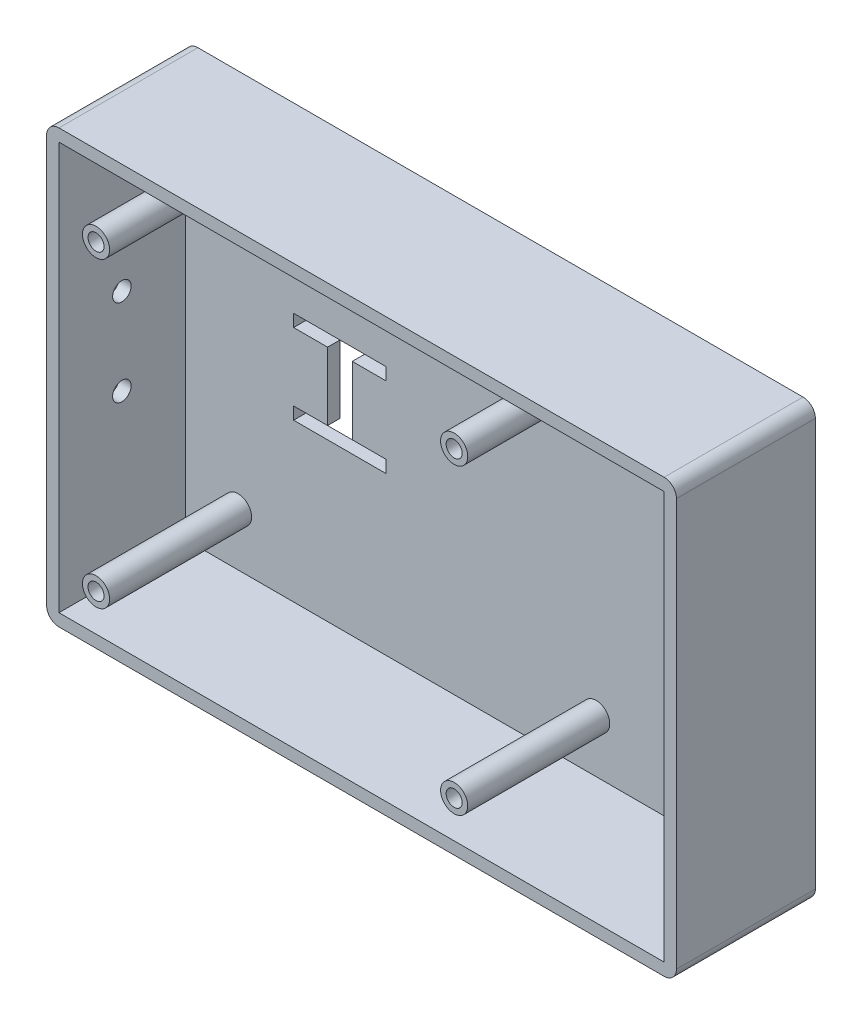
ISO-10303-21;
HEADER;
FILE_DESCRIPTION(('STEP AP214'),'2;1');
FILE_NAME('part.step','',(''),(''),'','','');
FILE_SCHEMA(('AUTOMOTIVE_DESIGN { 1 0 10303 214 1 1 1 1 }'));
ENDSEC;
DATA;
#1=APPLICATION_CONTEXT('core data for automotive mechanical design processes');
#2=APPLICATION_PROTOCOL_DEFINITION('international standard','automotive_design',2000,#1);
#3=PRODUCT_CONTEXT('',#1,'mechanical');
#4=PRODUCT('Part','Part','',(#3));
#5=PRODUCT_RELATED_PRODUCT_CATEGORY('part','',(#4));
#6=PRODUCT_DEFINITION_FORMATION('','',#4);
#7=PRODUCT_DEFINITION_CONTEXT('part definition',#1,'design');
#8=PRODUCT_DEFINITION('design','',#6,#7);
#9=PRODUCT_DEFINITION_SHAPE('','',#8);
#10=(LENGTH_UNIT() NAMED_UNIT(*) SI_UNIT(.MILLI.,.METRE.));
#11=(NAMED_UNIT(*) PLANE_ANGLE_UNIT() SI_UNIT($,.RADIAN.));
#12=(NAMED_UNIT(*) SI_UNIT($,.STERADIAN.) SOLID_ANGLE_UNIT());
#13=UNCERTAINTY_MEASURE_WITH_UNIT(LENGTH_MEASURE(1.E-05),#10,'distance_accuracy_value','');
#14=(GEOMETRIC_REPRESENTATION_CONTEXT(3) GLOBAL_UNCERTAINTY_ASSIGNED_CONTEXT((#13)) GLOBAL_UNIT_ASSIGNED_CONTEXT((#10,
#11,#12)) REPRESENTATION_CONTEXT('',''));
#15=CARTESIAN_POINT('',(0.,0.,0.));
#16=DIRECTION('',(0.,0.,1.));
#17=DIRECTION('',(1.,0.,0.));
#18=AXIS2_PLACEMENT_3D('',#15,#16,#17);
#19=CARTESIAN_POINT('',(-7.,0.,22.5));
#20=DIRECTION('',(-1.,0.,0.));
#21=DIRECTION('',(0.,0.,1.));
#22=AXIS2_PLACEMENT_3D('',#19,#20,#21);
#23=PLANE('',#22);
#24=DIRECTION('',(0.,1.,0.));
#25=VECTOR('',#24,1.);
#26=CARTESIAN_POINT('',(-7.,0.,0.));
#27=LINE('',#26,#25);
#28=CARTESIAN_POINT('',(-7.,-4.99999999999999,0.));
#29=VERTEX_POINT('',#28);
#30=CARTESIAN_POINT('',(-7.,61.,0.));
#31=VERTEX_POINT('',#30);
#32=EDGE_CURVE('E376',#29,#31,#27,.T.);
#33=ORIENTED_EDGE('',*,*,#32,.F.);
#34=DIRECTION('',(0.,0.,-1.));
#35=VECTOR('',#34,1.);
#36=CARTESIAN_POINT('',(-7.,-4.99999999999999,22.5));
#37=LINE('',#36,#35);
#38=CARTESIAN_POINT('',(-7.,-4.99999999999999,22.5));
#39=VERTEX_POINT('',#38);
#40=EDGE_CURVE('E404',#39,#29,#37,.T.);
#41=ORIENTED_EDGE('',*,*,#40,.F.);
#42=DIRECTION('',(0.,1.,0.));
#43=VECTOR('',#42,1.);
#44=CARTESIAN_POINT('',(-7.,0.,22.5));
#45=LINE('',#44,#43);
#46=CARTESIAN_POINT('',(-7.,61.,22.5));
#47=VERTEX_POINT('',#46);
#48=EDGE_CURVE('E354',#39,#47,#45,.T.);
#49=ORIENTED_EDGE('',*,*,#48,.T.);
#50=DIRECTION('',(0.,0.,-1.));
#51=VECTOR('',#50,1.);
#52=CARTESIAN_POINT('',(-7.,61.,22.5));
#53=LINE('',#52,#51);
#54=EDGE_CURVE('E406',#47,#31,#53,.T.);
#55=ORIENTED_EDGE('',*,*,#54,.T.);
#56=EDGE_LOOP('',(#33,#41,#49,#55));
#57=FACE_BOUND('',#56,.T.);
#58=CARTESIAN_POINT('',(-7.,35.,12.3117084700324));
#59=DIRECTION('',(-1.,0.,0.));
#60=DIRECTION('',(0.,0.,1.));
#61=AXIS2_PLACEMENT_3D('',#58,#59,#60);
#62=CIRCLE('',#61,1.5);
#63=CARTESIAN_POINT('',(-7.,35.,13.8117084700324));
#64=VERTEX_POINT('',#63);
#65=EDGE_CURVE('E435',#64,#64,#62,.T.);
#66=ORIENTED_EDGE('',*,*,#65,.F.);
#67=EDGE_LOOP('',(#66));
#68=FACE_BOUND('',#67,.T.);
#69=CARTESIAN_POINT('',(-7.,21.,12.3117084700324));
#70=DIRECTION('',(-1.,0.,0.));
#71=DIRECTION('',(0.,0.,1.));
#72=AXIS2_PLACEMENT_3D('',#69,#70,#71);
#73=CIRCLE('',#72,1.5);
#74=CARTESIAN_POINT('',(-7.,21.,13.8117084700324));
#75=VERTEX_POINT('',#74);
#76=EDGE_CURVE('E430',#75,#75,#73,.F.);
#77=ORIENTED_EDGE('',*,*,#76,.T.);
#78=EDGE_LOOP('',(#77));
#79=FACE_BOUND('',#78,.T.);
#80=ADVANCED_FACE('F33',(#57,#68,#79),#23,.T.);
#81=CARTESIAN_POINT('',(-5.,0.,22.5));
#82=DIRECTION('',(-1.,0.,0.));
#83=DIRECTION('',(0.,0.,1.));
#84=AXIS2_PLACEMENT_3D('',#81,#82,#83);
#85=PLANE('',#84);
#86=CARTESIAN_POINT('',(-5.,35.,12.3117084700324));
#87=DIRECTION('',(-1.,0.,0.));
#88=DIRECTION('',(0.,0.,1.));
#89=AXIS2_PLACEMENT_3D('',#86,#87,#88);
#90=CIRCLE('',#89,1.5);
#91=CARTESIAN_POINT('',(-5.,35.,13.8117084700324));
#92=VERTEX_POINT('',#91);
#93=EDGE_CURVE('E428',#92,#92,#90,.T.);
#94=ORIENTED_EDGE('',*,*,#93,.T.);
#95=EDGE_LOOP('',(#94));
#96=FACE_BOUND('',#95,.T.);
#97=DIRECTION('',(0.,1.,0.));
#98=VECTOR('',#97,1.);
#99=CARTESIAN_POINT('',(-5.,-5.,2.));
#100=LINE('',#99,#98);
#101=CARTESIAN_POINT('',(-5.,-5.,2.));
#102=VERTEX_POINT('',#101);
#103=CARTESIAN_POINT('',(-5.,61.,2.));
#104=VERTEX_POINT('',#103);
#105=EDGE_CURVE('E337',#102,#104,#100,.T.);
#106=ORIENTED_EDGE('',*,*,#105,.T.);
#107=DIRECTION('',(0.,0.,-1.));
#108=VECTOR('',#107,1.);
#109=CARTESIAN_POINT('',(-5.,61.,22.5));
#110=LINE('',#109,#108);
#111=CARTESIAN_POINT('',(-5.,61.,22.5));
#112=VERTEX_POINT('',#111);
#113=EDGE_CURVE('E413',#112,#104,#110,.T.);
#114=ORIENTED_EDGE('',*,*,#113,.F.);
#115=DIRECTION('',(0.,1.,0.));
#116=VECTOR('',#115,1.);
#117=CARTESIAN_POINT('',(-5.,0.,22.5));
#118=LINE('',#117,#116);
#119=CARTESIAN_POINT('',(-5.,-5.,22.5));
#120=VERTEX_POINT('',#119);
#121=EDGE_CURVE('E345',#120,#112,#118,.T.);
#122=ORIENTED_EDGE('',*,*,#121,.F.);
#123=DIRECTION('',(0.,0.,-1.));
#124=VECTOR('',#123,1.);
#125=CARTESIAN_POINT('',(-5.,-5.,22.5));
#126=LINE('',#125,#124);
#127=EDGE_CURVE('E416',#120,#102,#126,.T.);
#128=ORIENTED_EDGE('',*,*,#127,.T.);
#129=EDGE_LOOP('',(#106,#114,#122,#128));
#130=FACE_BOUND('',#129,.T.);
#131=CARTESIAN_POINT('',(-5.,21.,12.3117084700324));
#132=DIRECTION('',(-1.,0.,0.));
#133=DIRECTION('',(0.,0.,1.));
#134=AXIS2_PLACEMENT_3D('',#131,#132,#133);
#135=CIRCLE('',#134,1.5);
#136=CARTESIAN_POINT('',(-5.,21.,13.8117084700324));
#137=VERTEX_POINT('',#136);
#138=EDGE_CURVE('E37',#137,#137,#135,.F.);
#139=ORIENTED_EDGE('',*,*,#138,.F.);
#140=EDGE_LOOP('',(#139));
#141=FACE_BOUND('',#140,.T.);
#142=ADVANCED_FACE('F496',(#96,#130,#141),#85,.F.);
#143=CARTESIAN_POINT('',(0.,0.,2.));
#144=DIRECTION('',(0.,0.,1.));
#145=DIRECTION('',(1.,0.,0.));
#146=AXIS2_PLACEMENT_3D('',#143,#144,#145);
#147=PLANE('',#146);
#148=CARTESIAN_POINT('',(3.5,52.5,2.));
#149=DIRECTION('',(0.,0.,1.));
#150=DIRECTION('',(1.,0.,0.));
#151=AXIS2_PLACEMENT_3D('',#148,#149,#150);
#152=CIRCLE('',#151,2.2);
#153=CARTESIAN_POINT('',(5.7,52.5,2.));
#154=VERTEX_POINT('',#153);
#155=EDGE_CURVE('E298',#154,#154,#152,.F.);
#156=ORIENTED_EDGE('',*,*,#155,.T.);
#157=EDGE_LOOP('',(#156));
#158=FACE_BOUND('',#157,.T.);
#159=CARTESIAN_POINT('',(61.5,52.5,2.));
#160=DIRECTION('',(0.,0.,1.));
#161=DIRECTION('',(1.,0.,0.));
#162=AXIS2_PLACEMENT_3D('',#159,#160,#161);
#163=CIRCLE('',#162,2.2);
#164=CARTESIAN_POINT('',(63.7,52.5,2.));
#165=VERTEX_POINT('',#164);
#166=EDGE_CURVE('E307',#165,#165,#163,.F.);
#167=ORIENTED_EDGE('',*,*,#166,.T.);
#168=EDGE_LOOP('',(#167));
#169=FACE_BOUND('',#168,.T.);
#170=CARTESIAN_POINT('',(61.5000000000005,3.5,2.));
#171=DIRECTION('',(0.,0.,1.));
#172=DIRECTION('',(1.,0.,0.));
#173=AXIS2_PLACEMENT_3D('',#170,#171,#172);
#174=CIRCLE('',#173,2.2);
#175=CARTESIAN_POINT('',(63.7000000000005,3.5,2.));
#176=VERTEX_POINT('',#175);
#177=EDGE_CURVE('E319',#176,#176,#174,.F.);
#178=ORIENTED_EDGE('',*,*,#177,.T.);
#179=EDGE_LOOP('',(#178));
#180=FACE_BOUND('',#179,.T.);
#181=CARTESIAN_POINT('',(3.50000000000051,3.5,2.));
#182=DIRECTION('',(0.,0.,1.));
#183=DIRECTION('',(1.,0.,0.));
#184=AXIS2_PLACEMENT_3D('',#181,#182,#183);
#185=CIRCLE('',#184,2.2);
#186=CARTESIAN_POINT('',(5.70000000000051,3.5,2.));
#187=VERTEX_POINT('',#186);
#188=EDGE_CURVE('E331',#187,#187,#185,.F.);
#189=ORIENTED_EDGE('',*,*,#188,.T.);
#190=EDGE_LOOP('',(#189));
#191=FACE_BOUND('',#190,.T.);
#192=DIRECTION('',(1.,0.,0.));
#193=VECTOR('',#192,1.);
#194=CARTESIAN_POINT('',(-5.,-5.,2.));
#195=LINE('',#194,#193);
#196=CARTESIAN_POINT('',(93.,-5.,2.));
#197=VERTEX_POINT('',#196);
#198=EDGE_CURVE('E410',#102,#197,#195,.T.);
#199=ORIENTED_EDGE('',*,*,#198,.T.);
#200=DIRECTION('',(0.,1.,0.));
#201=VECTOR('',#200,1.);
#202=CARTESIAN_POINT('',(93.,-5.,2.));
#203=LINE('',#202,#201);
#204=CARTESIAN_POINT('',(93.,61.,2.00000000000001));
#205=VERTEX_POINT('',#204);
#206=EDGE_CURVE('E422',#197,#205,#203,.T.);
#207=ORIENTED_EDGE('',*,*,#206,.T.);
#208=DIRECTION('',(1.,0.,0.));
#209=VECTOR('',#208,1.);
#210=CARTESIAN_POINT('',(-5.,61.,2.));
#211=LINE('',#210,#209);
#212=EDGE_CURVE('E424',#104,#205,#211,.T.);
#213=ORIENTED_EDGE('',*,*,#212,.F.);
#214=ORIENTED_EDGE('',*,*,#105,.F.);
#215=EDGE_LOOP('',(#199,#207,#213,#214));
#216=FACE_BOUND('',#215,.T.);
#217=DIRECTION('',(0.,1.,0.));
#218=VECTOR('',#217,1.);
#219=CARTESIAN_POINT('',(27.4999999999995,-6.67868538251032E-13,2.));
#220=LINE('',#219,#218);
#221=CARTESIAN_POINT('',(27.5,20.5,2.));
#222=VERTEX_POINT('',#221);
#223=CARTESIAN_POINT('',(27.5000000000001,22.5000000000001,2.));
#224=VERTEX_POINT('',#223);
#225=EDGE_CURVE('E287',#222,#224,#220,.T.);
#226=ORIENTED_EDGE('',*,*,#225,.F.);
#227=DIRECTION('',(-1.,0.,0.));
#228=VECTOR('',#227,1.);
#229=CARTESIAN_POINT('',(0.,20.4999999999999,2.));
#230=LINE('',#229,#228);
#231=CARTESIAN_POINT('',(12.5,20.5,2.));
#232=VERTEX_POINT('',#231);
#233=EDGE_CURVE('E289',#222,#232,#230,.T.);
#234=ORIENTED_EDGE('',*,*,#233,.T.);
#235=DIRECTION('',(0.,1.,0.));
#236=VECTOR('',#235,1.);
#237=CARTESIAN_POINT('',(12.5,0.,2.));
#238=LINE('',#237,#236);
#239=CARTESIAN_POINT('',(12.5,22.5,2.));
#240=VERTEX_POINT('',#239);
#241=EDGE_CURVE('E245',#232,#240,#238,.T.);
#242=ORIENTED_EDGE('',*,*,#241,.T.);
#243=DIRECTION('',(1.,0.,0.));
#244=VECTOR('',#243,1.);
#245=CARTESIAN_POINT('',(0.,22.5,2.));
#246=LINE('',#245,#244);
#247=CARTESIAN_POINT('',(18.,22.5,2.));
#248=VERTEX_POINT('',#247);
#249=EDGE_CURVE('E202',#240,#248,#246,.T.);
#250=ORIENTED_EDGE('',*,*,#249,.T.);
#251=DIRECTION('',(0.,1.,0.));
#252=VECTOR('',#251,1.);
#253=CARTESIAN_POINT('',(18.,0.,2.));
#254=LINE('',#253,#252);
#255=CARTESIAN_POINT('',(18.,33.5,2.));
#256=VERTEX_POINT('',#255);
#257=EDGE_CURVE('E266',#248,#256,#254,.T.);
#258=ORIENTED_EDGE('',*,*,#257,.T.);
#259=DIRECTION('',(1.,0.,0.));
#260=VECTOR('',#259,1.);
#261=CARTESIAN_POINT('',(0.,33.5,2.));
#262=LINE('',#261,#260);
#263=CARTESIAN_POINT('',(12.5,33.5,2.));
#264=VERTEX_POINT('',#263);
#265=EDGE_CURVE('E269',#264,#256,#262,.T.);
#266=ORIENTED_EDGE('',*,*,#265,.F.);
#267=DIRECTION('',(0.,-1.,0.));
#268=VECTOR('',#267,1.);
#269=CARTESIAN_POINT('',(12.5000000000013,4.98732999343404E-13,2.));
#270=LINE('',#269,#268);
#271=CARTESIAN_POINT('',(12.4999999999999,35.4999999999999,2.));
#272=VERTEX_POINT('',#271);
#273=EDGE_CURVE('E271',#272,#264,#270,.T.);
#274=ORIENTED_EDGE('',*,*,#273,.F.);
#275=DIRECTION('',(1.,0.,0.));
#276=VECTOR('',#275,1.);
#277=CARTESIAN_POINT('',(-3.612850759301E-13,35.4999999999998,2.));
#278=LINE('',#277,#276);
#279=CARTESIAN_POINT('',(27.4999999999999,35.5,2.));
#280=VERTEX_POINT('',#279);
#281=EDGE_CURVE('E273',#272,#280,#278,.T.);
#282=ORIENTED_EDGE('',*,*,#281,.T.);
#283=DIRECTION('',(0.,-1.,0.));
#284=VECTOR('',#283,1.);
#285=CARTESIAN_POINT('',(27.4999999999995,-3.33934269125538E-13,2.));
#286=LINE('',#285,#284);
#287=CARTESIAN_POINT('',(27.4999999999999,33.5000000000001,2.));
#288=VERTEX_POINT('',#287);
#289=EDGE_CURVE('E276',#280,#288,#286,.T.);
#290=ORIENTED_EDGE('',*,*,#289,.T.);
#291=DIRECTION('',(-1.,0.,0.));
#292=VECTOR('',#291,1.);
#293=CARTESIAN_POINT('',(-4.6490589156178E-13,33.4999999999997,2.));
#294=LINE('',#293,#292);
#295=CARTESIAN_POINT('',(21.9999999999999,33.5,2.));
#296=VERTEX_POINT('',#295);
#297=EDGE_CURVE('E279',#288,#296,#294,.T.);
#298=ORIENTED_EDGE('',*,*,#297,.T.);
#299=DIRECTION('',(0.,-1.,0.));
#300=VECTOR('',#299,1.);
#301=CARTESIAN_POINT('',(22.0000000000004,3.05311331771924E-13,2.));
#302=LINE('',#301,#300);
#303=CARTESIAN_POINT('',(22.0000000000001,22.5,2.));
#304=VERTEX_POINT('',#303);
#305=EDGE_CURVE('E282',#296,#304,#302,.T.);
#306=ORIENTED_EDGE('',*,*,#305,.T.);
#307=DIRECTION('',(-1.,0.,0.));
#308=VECTOR('',#307,1.);
#309=CARTESIAN_POINT('',(-3.12250225675821E-13,22.4999999999997,2.));
#310=LINE('',#309,#308);
#311=EDGE_CURVE('E285',#224,#304,#310,.T.);
#312=ORIENTED_EDGE('',*,*,#311,.F.);
#313=EDGE_LOOP('',(#226,#234,#242,#250,#258,#266,#274,#282,#290,#298,#306,#312));
#314=FACE_BOUND('',#313,.T.);
#315=ADVANCED_FACE('F480',(#158,#169,#180,#191,#216,#314),#147,.T.);
#316=CARTESIAN_POINT('',(0.,0.,0.));
#317=DIRECTION('',(0.,0.,1.));
#318=DIRECTION('',(1.,0.,0.));
#319=AXIS2_PLACEMENT_3D('',#316,#317,#318);
#320=PLANE('',#319);
#321=DIRECTION('',(1.,0.,0.));
#322=VECTOR('',#321,1.);
#323=CARTESIAN_POINT('',(0.,63.,0.));
#324=LINE('',#323,#322);
#325=CARTESIAN_POINT('',(-4.99999999999999,63.,0.));
#326=VERTEX_POINT('',#325);
#327=CARTESIAN_POINT('',(93.,63.,0.));
#328=VERTEX_POINT('',#327);
#329=EDGE_CURVE('E334',#326,#328,#324,.T.);
#330=ORIENTED_EDGE('',*,*,#329,.T.);
#331=CARTESIAN_POINT('',(93.,61.,0.));
#332=DIRECTION('',(0.,0.,1.));
#333=DIRECTION('',(1.,0.,0.));
#334=AXIS2_PLACEMENT_3D('',#331,#332,#333);
#335=CIRCLE('',#334,2.);
#336=CARTESIAN_POINT('',(95.,61.,0.));
#337=VERTEX_POINT('',#336);
#338=EDGE_CURVE('E342',#328,#337,#335,.F.);
#339=ORIENTED_EDGE('',*,*,#338,.T.);
#340=DIRECTION('',(0.,1.,0.));
#341=VECTOR('',#340,1.);
#342=CARTESIAN_POINT('',(95.,0.,0.));
#343=LINE('',#342,#341);
#344=CARTESIAN_POINT('',(95.,-4.99999999999999,0.));
#345=VERTEX_POINT('',#344);
#346=EDGE_CURVE('E388',#345,#337,#343,.T.);
#347=ORIENTED_EDGE('',*,*,#346,.F.);
#348=CARTESIAN_POINT('',(93.,-5.,0.));
#349=DIRECTION('',(0.,0.,1.));
#350=DIRECTION('',(1.,0.,0.));
#351=AXIS2_PLACEMENT_3D('',#348,#349,#350);
#352=CIRCLE('',#351,2.);
#353=CARTESIAN_POINT('',(93.,-7.,0.));
#354=VERTEX_POINT('',#353);
#355=EDGE_CURVE('E385',#345,#354,#352,.F.);
#356=ORIENTED_EDGE('',*,*,#355,.T.);
#357=DIRECTION('',(1.,0.,0.));
#358=VECTOR('',#357,1.);
#359=CARTESIAN_POINT('',(0.,-7.,0.));
#360=LINE('',#359,#358);
#361=CARTESIAN_POINT('',(-4.99999999999999,-7.,0.));
#362=VERTEX_POINT('',#361);
#363=EDGE_CURVE('E382',#362,#354,#360,.T.);
#364=ORIENTED_EDGE('',*,*,#363,.F.);
#365=CARTESIAN_POINT('',(-5.,-5.,0.));
#366=DIRECTION('',(0.,0.,1.));
#367=DIRECTION('',(1.,0.,0.));
#368=AXIS2_PLACEMENT_3D('',#365,#366,#367);
#369=CIRCLE('',#368,2.);
#370=EDGE_CURVE('E379',#362,#29,#369,.F.);
#371=ORIENTED_EDGE('',*,*,#370,.T.);
#372=ORIENTED_EDGE('',*,*,#32,.T.);
#373=CARTESIAN_POINT('',(-5.,61.,0.));
#374=DIRECTION('',(0.,0.,1.));
#375=DIRECTION('',(1.,0.,0.));
#376=AXIS2_PLACEMENT_3D('',#373,#374,#375);
#377=CIRCLE('',#376,2.);
#378=EDGE_CURVE('E373',#326,#31,#377,.T.);
#379=ORIENTED_EDGE('',*,*,#378,.F.);
#380=EDGE_LOOP('',(#330,#339,#347,#356,#364,#371,#372,#379));
#381=FACE_BOUND('',#380,.T.);
#382=DIRECTION('',(1.,0.,0.));
#383=VECTOR('',#382,1.);
#384=CARTESIAN_POINT('',(0.,20.4999999999999,0.));
#385=LINE('',#384,#383);
#386=CARTESIAN_POINT('',(12.5,20.5,0.));
#387=VERTEX_POINT('',#386);
#388=CARTESIAN_POINT('',(27.5,20.5,0.));
#389=VERTEX_POINT('',#388);
#390=EDGE_CURVE('E58',#387,#389,#385,.T.);
#391=ORIENTED_EDGE('',*,*,#390,.T.);
#392=DIRECTION('',(0.,-1.,0.));
#393=VECTOR('',#392,1.);
#394=CARTESIAN_POINT('',(27.4999999999995,-6.67868538251032E-13,0.));
#395=LINE('',#394,#393);
#396=CARTESIAN_POINT('',(27.5000000000001,22.5000000000001,0.));
#397=VERTEX_POINT('',#396);
#398=EDGE_CURVE('E240',#397,#389,#395,.T.);
#399=ORIENTED_EDGE('',*,*,#398,.F.);
#400=DIRECTION('',(1.,0.,0.));
#401=VECTOR('',#400,1.);
#402=CARTESIAN_POINT('',(-3.12250225675821E-13,22.4999999999997,0.));
#403=LINE('',#402,#401);
#404=CARTESIAN_POINT('',(22.0000000000001,22.5,0.));
#405=VERTEX_POINT('',#404);
#406=EDGE_CURVE('E237',#405,#397,#403,.T.);
#407=ORIENTED_EDGE('',*,*,#406,.F.);
#408=DIRECTION('',(0.,1.,0.));
#409=VECTOR('',#408,1.);
#410=CARTESIAN_POINT('',(22.0000000000004,3.05311331771924E-13,0.));
#411=LINE('',#410,#409);
#412=CARTESIAN_POINT('',(21.9999999999999,33.5,0.));
#413=VERTEX_POINT('',#412);
#414=EDGE_CURVE('E234',#405,#413,#411,.T.);
#415=ORIENTED_EDGE('',*,*,#414,.T.);
#416=DIRECTION('',(1.,0.,0.));
#417=VECTOR('',#416,1.);
#418=CARTESIAN_POINT('',(-4.6490589156178E-13,33.4999999999997,0.));
#419=LINE('',#418,#417);
#420=CARTESIAN_POINT('',(27.4999999999999,33.5000000000001,0.));
#421=VERTEX_POINT('',#420);
#422=EDGE_CURVE('E231',#413,#421,#419,.T.);
#423=ORIENTED_EDGE('',*,*,#422,.T.);
#424=DIRECTION('',(0.,1.,0.));
#425=VECTOR('',#424,1.);
#426=CARTESIAN_POINT('',(27.4999999999995,-3.33934269125538E-13,0.));
#427=LINE('',#426,#425);
#428=CARTESIAN_POINT('',(27.4999999999999,35.5,0.));
#429=VERTEX_POINT('',#428);
#430=EDGE_CURVE('E228',#421,#429,#427,.T.);
#431=ORIENTED_EDGE('',*,*,#430,.T.);
#432=DIRECTION('',(-1.,0.,0.));
#433=VECTOR('',#432,1.);
#434=CARTESIAN_POINT('',(-3.612850759301E-13,35.4999999999998,0.));
#435=LINE('',#434,#433);
#436=CARTESIAN_POINT('',(12.4999999999999,35.4999999999999,0.));
#437=VERTEX_POINT('',#436);
#438=EDGE_CURVE('E225',#429,#437,#435,.T.);
#439=ORIENTED_EDGE('',*,*,#438,.T.);
#440=DIRECTION('',(0.,1.,0.));
#441=VECTOR('',#440,1.);
#442=CARTESIAN_POINT('',(12.5000000000013,4.98732999343404E-13,0.));
#443=LINE('',#442,#441);
#444=CARTESIAN_POINT('',(12.5,33.5,0.));
#445=VERTEX_POINT('',#444);
#446=EDGE_CURVE('E222',#445,#437,#443,.T.);
#447=ORIENTED_EDGE('',*,*,#446,.F.);
#448=DIRECTION('',(-1.,0.,0.));
#449=VECTOR('',#448,1.);
#450=CARTESIAN_POINT('',(0.,33.5,0.));
#451=LINE('',#450,#449);
#452=CARTESIAN_POINT('',(18.,33.5,0.));
#453=VERTEX_POINT('',#452);
#454=EDGE_CURVE('E216',#453,#445,#451,.T.);
#455=ORIENTED_EDGE('',*,*,#454,.F.);
#456=DIRECTION('',(0.,-1.,0.));
#457=VECTOR('',#456,1.);
#458=CARTESIAN_POINT('',(18.,0.,0.));
#459=LINE('',#458,#457);
#460=CARTESIAN_POINT('',(18.,22.5,0.));
#461=VERTEX_POINT('',#460);
#462=EDGE_CURVE('E214',#453,#461,#459,.T.);
#463=ORIENTED_EDGE('',*,*,#462,.T.);
#464=DIRECTION('',(-1.,0.,0.));
#465=VECTOR('',#464,1.);
#466=CARTESIAN_POINT('',(0.,22.5,0.));
#467=LINE('',#466,#465);
#468=CARTESIAN_POINT('',(12.5,22.5,0.));
#469=VERTEX_POINT('',#468);
#470=EDGE_CURVE('E199',#461,#469,#467,.T.);
#471=ORIENTED_EDGE('',*,*,#470,.T.);
#472=DIRECTION('',(0.,-1.,0.));
#473=VECTOR('',#472,1.);
#474=CARTESIAN_POINT('',(12.5,0.,0.));
#475=LINE('',#474,#473);
#476=EDGE_CURVE('E208',#469,#387,#475,.T.);
#477=ORIENTED_EDGE('',*,*,#476,.T.);
#478=EDGE_LOOP('',(#391,#399,#407,#415,#423,#431,#439,#447,#455,#463,#471,#477));
#479=FACE_BOUND('',#478,.T.);
#480=ADVANCED_FACE('F35',(#381,#479),#320,.F.);
#481=CARTESIAN_POINT('',(0.,63.,22.5));
#482=DIRECTION('',(0.,1.,0.));
#483=DIRECTION('',(0.,0.,1.));
#484=AXIS2_PLACEMENT_3D('',#481,#482,#483);
#485=PLANE('',#484);
#486=ORIENTED_EDGE('',*,*,#329,.F.);
#487=DIRECTION('',(0.,0.,-1.));
#488=VECTOR('',#487,1.);
#489=CARTESIAN_POINT('',(-4.99999999999999,63.,22.5));
#490=LINE('',#489,#488);
#491=CARTESIAN_POINT('',(-4.99999999999999,63.,22.5));
#492=VERTEX_POINT('',#491);
#493=EDGE_CURVE('E408',#492,#326,#490,.T.);
#494=ORIENTED_EDGE('',*,*,#493,.F.);
#495=DIRECTION('',(1.,0.,0.));
#496=VECTOR('',#495,1.);
#497=CARTESIAN_POINT('',(0.,63.,22.5));
#498=LINE('',#497,#496);
#499=CARTESIAN_POINT('',(93.,63.,22.5));
#500=VERTEX_POINT('',#499);
#501=EDGE_CURVE('E349',#492,#500,#498,.T.);
#502=ORIENTED_EDGE('',*,*,#501,.T.);
#503=DIRECTION('',(0.,0.,-1.));
#504=VECTOR('',#503,1.);
#505=CARTESIAN_POINT('',(93.,63.,22.5));
#506=LINE('',#505,#504);
#507=EDGE_CURVE('E393',#500,#328,#506,.T.);
#508=ORIENTED_EDGE('',*,*,#507,.T.);
#509=EDGE_LOOP('',(#486,#494,#502,#508));
#510=FACE_BOUND('',#509,.T.);
#511=ADVANCED_FACE('F512',(#510),#485,.T.);
#512=CARTESIAN_POINT('',(-5.,61.,22.5));
#513=DIRECTION('',(0.,0.,-1.));
#514=DIRECTION('',(-1.,0.,0.));
#515=AXIS2_PLACEMENT_3D('',#512,#513,#514);
#516=CYLINDRICAL_SURFACE('',#515,2.);
#517=ORIENTED_EDGE('',*,*,#378,.T.);
#518=ORIENTED_EDGE('',*,*,#54,.F.);
#519=CARTESIAN_POINT('',(-5.,61.,22.5));
#520=DIRECTION('',(0.,0.,1.));
#521=DIRECTION('',(1.,0.,0.));
#522=AXIS2_PLACEMENT_3D('',#519,#520,#521);
#523=CIRCLE('',#522,2.);
#524=EDGE_CURVE('E352',#492,#47,#523,.T.);
#525=ORIENTED_EDGE('',*,*,#524,.F.);
#526=ORIENTED_EDGE('',*,*,#493,.T.);
#527=EDGE_LOOP('',(#517,#518,#525,#526));
#528=FACE_BOUND('',#527,.T.);
#529=ADVANCED_FACE('F509',(#528),#516,.T.);
#530=CARTESIAN_POINT('',(-5.,-5.,22.5));
#531=DIRECTION('',(0.,0.,-1.));
#532=DIRECTION('',(-1.,0.,0.));
#533=AXIS2_PLACEMENT_3D('',#530,#531,#532);
#534=CYLINDRICAL_SURFACE('',#533,2.);
#535=ORIENTED_EDGE('',*,*,#370,.F.);
#536=DIRECTION('',(0.,0.,-1.));
#537=VECTOR('',#536,1.);
#538=CARTESIAN_POINT('',(-4.99999999999999,-7.,22.5));
#539=LINE('',#538,#537);
#540=CARTESIAN_POINT('',(-4.99999999999999,-7.,22.5));
#541=VERTEX_POINT('',#540);
#542=EDGE_CURVE('E402',#541,#362,#539,.T.);
#543=ORIENTED_EDGE('',*,*,#542,.F.);
#544=CARTESIAN_POINT('',(-5.,-5.,22.5));
#545=DIRECTION('',(0.,0.,1.));
#546=DIRECTION('',(1.,0.,0.));
#547=AXIS2_PLACEMENT_3D('',#544,#545,#546);
#548=CIRCLE('',#547,2.);
#549=EDGE_CURVE('E357',#541,#39,#548,.F.);
#550=ORIENTED_EDGE('',*,*,#549,.T.);
#551=ORIENTED_EDGE('',*,*,#40,.T.);
#552=EDGE_LOOP('',(#535,#543,#550,#551));
#553=FACE_BOUND('',#552,.T.);
#554=ADVANCED_FACE('F507',(#553),#534,.T.);
#555=CARTESIAN_POINT('',(0.,-7.,22.5));
#556=DIRECTION('',(0.,1.,0.));
#557=DIRECTION('',(0.,0.,1.));
#558=AXIS2_PLACEMENT_3D('',#555,#556,#557);
#559=PLANE('',#558);
#560=ORIENTED_EDGE('',*,*,#363,.T.);
#561=DIRECTION('',(0.,0.,-1.));
#562=VECTOR('',#561,1.);
#563=CARTESIAN_POINT('',(93.,-7.,22.5));
#564=LINE('',#563,#562);
#565=CARTESIAN_POINT('',(93.,-7.,22.5));
#566=VERTEX_POINT('',#565);
#567=EDGE_CURVE('E400',#566,#354,#564,.T.);
#568=ORIENTED_EDGE('',*,*,#567,.F.);
#569=DIRECTION('',(1.,0.,0.));
#570=VECTOR('',#569,1.);
#571=CARTESIAN_POINT('',(0.,-7.,22.5));
#572=LINE('',#571,#570);
#573=EDGE_CURVE('E360',#541,#566,#572,.T.);
#574=ORIENTED_EDGE('',*,*,#573,.F.);
#575=ORIENTED_EDGE('',*,*,#542,.T.);
#576=EDGE_LOOP('',(#560,#568,#574,#575));
#577=FACE_BOUND('',#576,.T.);
#578=ADVANCED_FACE('F616',(#577),#559,.F.);
#579=CARTESIAN_POINT('',(93.,-5.,22.5));
#580=DIRECTION('',(0.,0.,-1.));
#581=DIRECTION('',(-1.,0.,0.));
#582=AXIS2_PLACEMENT_3D('',#579,#580,#581);
#583=CYLINDRICAL_SURFACE('',#582,2.);
#584=ORIENTED_EDGE('',*,*,#355,.F.);
#585=DIRECTION('',(0.,0.,-1.));
#586=VECTOR('',#585,1.);
#587=CARTESIAN_POINT('',(95.,-4.99999999999999,22.5));
#588=LINE('',#587,#586);
#589=CARTESIAN_POINT('',(95.,-4.99999999999999,22.5));
#590=VERTEX_POINT('',#589);
#591=EDGE_CURVE('E398',#590,#345,#588,.T.);
#592=ORIENTED_EDGE('',*,*,#591,.F.);
#593=CARTESIAN_POINT('',(93.,-5.,22.5));
#594=DIRECTION('',(0.,0.,1.));
#595=DIRECTION('',(1.,0.,0.));
#596=AXIS2_PLACEMENT_3D('',#593,#594,#595);
#597=CIRCLE('',#596,2.);
#598=EDGE_CURVE('E362',#590,#566,#597,.F.);
#599=ORIENTED_EDGE('',*,*,#598,.T.);
#600=ORIENTED_EDGE('',*,*,#567,.T.);
#601=EDGE_LOOP('',(#584,#592,#599,#600));
#602=FACE_BOUND('',#601,.T.);
#603=ADVANCED_FACE('F613',(#602),#583,.T.);
#604=CARTESIAN_POINT('',(95.,0.,22.5));
#605=DIRECTION('',(-1.,0.,0.));
#606=DIRECTION('',(0.,0.,1.));
#607=AXIS2_PLACEMENT_3D('',#604,#605,#606);
#608=PLANE('',#607);
#609=ORIENTED_EDGE('',*,*,#346,.T.);
#610=DIRECTION('',(0.,0.,-1.));
#611=VECTOR('',#610,1.);
#612=CARTESIAN_POINT('',(95.,61.,22.5));
#613=LINE('',#612,#611);
#614=CARTESIAN_POINT('',(95.,61.,22.5));
#615=VERTEX_POINT('',#614);
#616=EDGE_CURVE('E395',#615,#337,#613,.T.);
#617=ORIENTED_EDGE('',*,*,#616,.F.);
#618=DIRECTION('',(0.,1.,0.));
#619=VECTOR('',#618,1.);
#620=CARTESIAN_POINT('',(95.,0.,22.5));
#621=LINE('',#620,#619);
#622=EDGE_CURVE('E365',#590,#615,#621,.T.);
#623=ORIENTED_EDGE('',*,*,#622,.F.);
#624=ORIENTED_EDGE('',*,*,#591,.T.);
#625=EDGE_LOOP('',(#609,#617,#623,#624));
#626=FACE_BOUND('',#625,.T.);
#627=ADVANCED_FACE('F528',(#626),#608,.F.);
#628=CARTESIAN_POINT('',(93.0000000000002,2.58126853225349E-13,22.5));
#629=DIRECTION('',(-1.,0.,0.));
#630=DIRECTION('',(0.,-1.,0.));
#631=AXIS2_PLACEMENT_3D('',#628,#629,#630);
#632=PLANE('',#631);
#633=DIRECTION('',(0.,0.,-1.));
#634=VECTOR('',#633,1.);
#635=CARTESIAN_POINT('',(93.,61.,22.5));
#636=LINE('',#635,#634);
#637=CARTESIAN_POINT('',(93.,61.,22.5));
#638=VERTEX_POINT('',#637);
#639=EDGE_CURVE('E370',#638,#205,#636,.T.);
#640=ORIENTED_EDGE('',*,*,#639,.T.);
#641=ORIENTED_EDGE('',*,*,#206,.F.);
#642=DIRECTION('',(0.,0.,-1.));
#643=VECTOR('',#642,1.);
#644=CARTESIAN_POINT('',(93.,-5.,22.5));
#645=LINE('',#644,#643);
#646=CARTESIAN_POINT('',(93.,-5.,22.5));
#647=VERTEX_POINT('',#646);
#648=EDGE_CURVE('E396',#647,#197,#645,.T.);
#649=ORIENTED_EDGE('',*,*,#648,.F.);
#650=DIRECTION('',(0.,1.,0.));
#651=VECTOR('',#650,1.);
#652=CARTESIAN_POINT('',(93.0000000000002,2.58126853225349E-13,22.5));
#653=LINE('',#652,#651);
#654=EDGE_CURVE('E338',#647,#638,#653,.T.);
#655=ORIENTED_EDGE('',*,*,#654,.T.);
#656=EDGE_LOOP('',(#640,#641,#649,#655));
#657=FACE_BOUND('',#656,.T.);
#658=ADVANCED_FACE('F525',(#657),#632,.T.);
#659=CARTESIAN_POINT('',(0.,-5.,22.5));
#660=DIRECTION('',(0.,1.,0.));
#661=DIRECTION('',(0.,0.,1.));
#662=AXIS2_PLACEMENT_3D('',#659,#660,#661);
#663=PLANE('',#662);
#664=ORIENTED_EDGE('',*,*,#648,.T.);
#665=ORIENTED_EDGE('',*,*,#198,.F.);
#666=ORIENTED_EDGE('',*,*,#127,.F.);
#667=DIRECTION('',(1.,0.,0.));
#668=VECTOR('',#667,1.);
#669=CARTESIAN_POINT('',(0.,-5.,22.5));
#670=LINE('',#669,#668);
#671=EDGE_CURVE('E341',#120,#647,#670,.T.);
#672=ORIENTED_EDGE('',*,*,#671,.T.);
#673=EDGE_LOOP('',(#664,#665,#666,#672));
#674=FACE_BOUND('',#673,.T.);
#675=ADVANCED_FACE('F520',(#674),#663,.T.);
#676=CARTESIAN_POINT('',(0.,61.,22.5));
#677=DIRECTION('',(0.,1.,0.));
#678=DIRECTION('',(0.,0.,1.));
#679=AXIS2_PLACEMENT_3D('',#676,#677,#678);
#680=PLANE('',#679);
#681=ORIENTED_EDGE('',*,*,#212,.T.);
#682=ORIENTED_EDGE('',*,*,#639,.F.);
#683=DIRECTION('',(1.,0.,0.));
#684=VECTOR('',#683,1.);
#685=CARTESIAN_POINT('',(0.,61.,22.5));
#686=LINE('',#685,#684);
#687=EDGE_CURVE('E347',#112,#638,#686,.T.);
#688=ORIENTED_EDGE('',*,*,#687,.F.);
#689=ORIENTED_EDGE('',*,*,#113,.T.);
#690=EDGE_LOOP('',(#681,#682,#688,#689));
#691=FACE_BOUND('',#690,.T.);
#692=ADVANCED_FACE('F517',(#691),#680,.F.);
#693=CARTESIAN_POINT('',(93.,61.,22.5));
#694=DIRECTION('',(0.,0.,-1.));
#695=DIRECTION('',(-1.,0.,0.));
#696=AXIS2_PLACEMENT_3D('',#693,#694,#695);
#697=CYLINDRICAL_SURFACE('',#696,2.);
#698=ORIENTED_EDGE('',*,*,#338,.F.);
#699=ORIENTED_EDGE('',*,*,#507,.F.);
#700=CARTESIAN_POINT('',(93.,61.,22.5));
#701=DIRECTION('',(0.,0.,1.));
#702=DIRECTION('',(1.,0.,0.));
#703=AXIS2_PLACEMENT_3D('',#700,#701,#702);
#704=CIRCLE('',#703,2.);
#705=EDGE_CURVE('E367',#500,#615,#704,.F.);
#706=ORIENTED_EDGE('',*,*,#705,.T.);
#707=ORIENTED_EDGE('',*,*,#616,.T.);
#708=EDGE_LOOP('',(#698,#699,#706,#707));
#709=FACE_BOUND('',#708,.T.);
#710=ADVANCED_FACE('F519',(#709),#697,.T.);
#711=CARTESIAN_POINT('',(0.,0.,22.5));
#712=DIRECTION('',(0.,0.,1.));
#713=DIRECTION('',(1.,0.,0.));
#714=AXIS2_PLACEMENT_3D('',#711,#712,#713);
#715=PLANE('',#714);
#716=ORIENTED_EDGE('',*,*,#654,.F.);
#717=ORIENTED_EDGE('',*,*,#671,.F.);
#718=ORIENTED_EDGE('',*,*,#121,.T.);
#719=ORIENTED_EDGE('',*,*,#687,.T.);
#720=EDGE_LOOP('',(#716,#717,#718,#719));
#721=FACE_BOUND('',#720,.T.);
#722=ORIENTED_EDGE('',*,*,#501,.F.);
#723=ORIENTED_EDGE('',*,*,#524,.T.);
#724=ORIENTED_EDGE('',*,*,#48,.F.);
#725=ORIENTED_EDGE('',*,*,#549,.F.);
#726=ORIENTED_EDGE('',*,*,#573,.T.);
#727=ORIENTED_EDGE('',*,*,#598,.F.);
#728=ORIENTED_EDGE('',*,*,#622,.T.);
#729=ORIENTED_EDGE('',*,*,#705,.F.);
#730=EDGE_LOOP('',(#722,#723,#724,#725,#726,#727,#728,#729));
#731=FACE_BOUND('',#730,.T.);
#732=ADVANCED_FACE('F603',(#721,#731),#715,.T.);
#733=CARTESIAN_POINT('',(3.50000000000051,3.5,25.));
#734=DIRECTION('',(0.,0.,-1.));
#735=DIRECTION('',(-1.,0.,0.));
#736=AXIS2_PLACEMENT_3D('',#733,#734,#735);
#737=CYLINDRICAL_SURFACE('',#736,1.3);
#738=CARTESIAN_POINT('',(3.50000000000051,3.5,2.));
#739=DIRECTION('',(0.,0.,1.));
#740=DIRECTION('',(1.,0.,0.));
#741=AXIS2_PLACEMENT_3D('',#738,#739,#740);
#742=CIRCLE('',#741,1.3);
#743=CARTESIAN_POINT('',(4.80000000000051,3.5,2.));
#744=VERTEX_POINT('',#743);
#745=EDGE_CURVE('E325',#744,#744,#742,.F.);
#746=ORIENTED_EDGE('',*,*,#745,.T.);
#747=EDGE_LOOP('',(#746));
#748=FACE_BOUND('',#747,.T.);
#749=CARTESIAN_POINT('',(3.50000000000051,3.5,25.));
#750=DIRECTION('',(0.,0.,1.));
#751=DIRECTION('',(1.,0.,0.));
#752=AXIS2_PLACEMENT_3D('',#749,#750,#751);
#753=CIRCLE('',#752,1.3);
#754=CARTESIAN_POINT('',(4.80000000000051,3.5,25.));
#755=VERTEX_POINT('',#754);
#756=EDGE_CURVE('E322',#755,#755,#753,.T.);
#757=ORIENTED_EDGE('',*,*,#756,.T.);
#758=EDGE_LOOP('',(#757));
#759=FACE_BOUND('',#758,.T.);
#760=ADVANCED_FACE('F599',(#748,#759),#737,.F.);
#761=CARTESIAN_POINT('',(3.50000000000051,3.5,25.));
#762=DIRECTION('',(0.,0.,-1.));
#763=DIRECTION('',(-1.,0.,0.));
#764=AXIS2_PLACEMENT_3D('',#761,#762,#763);
#765=CYLINDRICAL_SURFACE('',#764,2.2);
#766=ORIENTED_EDGE('',*,*,#188,.F.);
#767=EDGE_LOOP('',(#766));
#768=FACE_BOUND('',#767,.T.);
#769=CARTESIAN_POINT('',(3.50000000000051,3.5,25.));
#770=DIRECTION('',(0.,0.,1.));
#771=DIRECTION('',(1.,0.,0.));
#772=AXIS2_PLACEMENT_3D('',#769,#770,#771);
#773=CIRCLE('',#772,2.2);
#774=CARTESIAN_POINT('',(5.70000000000051,3.5,25.));
#775=VERTEX_POINT('',#774);
#776=EDGE_CURVE('E328',#775,#775,#773,.T.);
#777=ORIENTED_EDGE('',*,*,#776,.F.);
#778=EDGE_LOOP('',(#777));
#779=FACE_BOUND('',#778,.T.);
#780=ADVANCED_FACE('F550',(#768,#779),#765,.T.);
#781=CARTESIAN_POINT('',(0.,0.,25.));
#782=DIRECTION('',(0.,0.,1.));
#783=DIRECTION('',(1.,0.,0.));
#784=AXIS2_PLACEMENT_3D('',#781,#782,#783);
#785=PLANE('',#784);
#786=ORIENTED_EDGE('',*,*,#756,.F.);
#787=EDGE_LOOP('',(#786));
#788=FACE_BOUND('',#787,.T.);
#789=ORIENTED_EDGE('',*,*,#776,.T.);
#790=EDGE_LOOP('',(#789));
#791=FACE_BOUND('',#790,.T.);
#792=ADVANCED_FACE('F540',(#788,#791),#785,.T.);
#793=ORIENTED_EDGE('',*,*,#745,.F.);
#794=EDGE_LOOP('',(#793));
#795=FACE_BOUND('',#794,.T.);
#796=ADVANCED_FACE('F532',(#795),#147,.T.);
#797=CARTESIAN_POINT('',(61.5000000000005,3.5,25.));
#798=DIRECTION('',(0.,0.,-1.));
#799=DIRECTION('',(-1.,0.,0.));
#800=AXIS2_PLACEMENT_3D('',#797,#798,#799);
#801=CYLINDRICAL_SURFACE('',#800,1.29999999999999);
#802=CARTESIAN_POINT('',(61.5000000000005,3.5,2.));
#803=DIRECTION('',(0.,0.,1.));
#804=DIRECTION('',(1.,0.,0.));
#805=AXIS2_PLACEMENT_3D('',#802,#803,#804);
#806=CIRCLE('',#805,1.29999999999999);
#807=CARTESIAN_POINT('',(62.8000000000005,3.5,2.));
#808=VERTEX_POINT('',#807);
#809=EDGE_CURVE('E313',#808,#808,#806,.F.);
#810=ORIENTED_EDGE('',*,*,#809,.T.);
#811=EDGE_LOOP('',(#810));
#812=FACE_BOUND('',#811,.T.);
#813=CARTESIAN_POINT('',(61.5000000000005,3.5,25.));
#814=DIRECTION('',(0.,0.,1.));
#815=DIRECTION('',(1.,0.,0.));
#816=AXIS2_PLACEMENT_3D('',#813,#814,#815);
#817=CIRCLE('',#816,1.29999999999999);
#818=CARTESIAN_POINT('',(62.8000000000005,3.5,25.));
#819=VERTEX_POINT('',#818);
#820=EDGE_CURVE('E310',#819,#819,#817,.T.);
#821=ORIENTED_EDGE('',*,*,#820,.T.);
#822=EDGE_LOOP('',(#821));
#823=FACE_BOUND('',#822,.T.);
#824=ADVANCED_FACE('F539',(#812,#823),#801,.F.);
#825=CARTESIAN_POINT('',(61.5000000000005,3.5,25.));
#826=DIRECTION('',(0.,0.,-1.));
#827=DIRECTION('',(-1.,0.,0.));
#828=AXIS2_PLACEMENT_3D('',#825,#826,#827);
#829=CYLINDRICAL_SURFACE('',#828,2.2);
#830=ORIENTED_EDGE('',*,*,#177,.F.);
#831=EDGE_LOOP('',(#830));
#832=FACE_BOUND('',#831,.T.);
#833=CARTESIAN_POINT('',(61.5000000000005,3.5,25.));
#834=DIRECTION('',(0.,0.,1.));
#835=DIRECTION('',(1.,0.,0.));
#836=AXIS2_PLACEMENT_3D('',#833,#834,#835);
#837=CIRCLE('',#836,2.2);
#838=CARTESIAN_POINT('',(63.7000000000005,3.5,25.));
#839=VERTEX_POINT('',#838);
#840=EDGE_CURVE('E316',#839,#839,#837,.T.);
#841=ORIENTED_EDGE('',*,*,#840,.F.);
#842=EDGE_LOOP('',(#841));
#843=FACE_BOUND('',#842,.T.);
#844=ADVANCED_FACE('F547',(#832,#843),#829,.T.);
#845=CARTESIAN_POINT('',(0.,0.,25.));
#846=DIRECTION('',(0.,0.,1.));
#847=DIRECTION('',(1.,0.,0.));
#848=AXIS2_PLACEMENT_3D('',#845,#846,#847);
#849=PLANE('',#848);
#850=ORIENTED_EDGE('',*,*,#820,.F.);
#851=EDGE_LOOP('',(#850));
#852=FACE_BOUND('',#851,.T.);
#853=ORIENTED_EDGE('',*,*,#840,.T.);
#854=EDGE_LOOP('',(#853));
#855=FACE_BOUND('',#854,.T.);
#856=ADVANCED_FACE('F556',(#852,#855),#849,.T.);
#857=ORIENTED_EDGE('',*,*,#809,.F.);
#858=EDGE_LOOP('',(#857));
#859=FACE_BOUND('',#858,.T.);
#860=ADVANCED_FACE('F542',(#859),#147,.T.);
#861=CARTESIAN_POINT('',(61.5,52.5,25.));
#862=DIRECTION('',(0.,0.,-1.));
#863=DIRECTION('',(-1.,0.,0.));
#864=AXIS2_PLACEMENT_3D('',#861,#862,#863);
#865=CYLINDRICAL_SURFACE('',#864,1.29999999999999);
#866=CARTESIAN_POINT('',(61.5,52.5,2.));
#867=DIRECTION('',(0.,0.,1.));
#868=DIRECTION('',(1.,0.,0.));
#869=AXIS2_PLACEMENT_3D('',#866,#867,#868);
#870=CIRCLE('',#869,1.29999999999999);
#871=CARTESIAN_POINT('',(62.8,52.5,2.));
#872=VERTEX_POINT('',#871);
#873=EDGE_CURVE('E42',#872,#872,#870,.F.);
#874=ORIENTED_EDGE('',*,*,#873,.T.);
#875=EDGE_LOOP('',(#874));
#876=FACE_BOUND('',#875,.T.);
#877=CARTESIAN_POINT('',(61.5,52.5,25.));
#878=DIRECTION('',(0.,0.,1.));
#879=DIRECTION('',(1.,0.,0.));
#880=AXIS2_PLACEMENT_3D('',#877,#878,#879);
#881=CIRCLE('',#880,1.29999999999999);
#882=CARTESIAN_POINT('',(62.8,52.5,25.));
#883=VERTEX_POINT('',#882);
#884=EDGE_CURVE('E300',#883,#883,#881,.T.);
#885=ORIENTED_EDGE('',*,*,#884,.T.);
#886=EDGE_LOOP('',(#885));
#887=FACE_BOUND('',#886,.T.);
#888=ADVANCED_FACE('F555',(#876,#887),#865,.F.);
#889=CARTESIAN_POINT('',(61.5,52.5,25.));
#890=DIRECTION('',(0.,0.,-1.));
#891=DIRECTION('',(-1.,0.,0.));
#892=AXIS2_PLACEMENT_3D('',#889,#890,#891);
#893=CYLINDRICAL_SURFACE('',#892,2.2);
#894=ORIENTED_EDGE('',*,*,#166,.F.);
#895=EDGE_LOOP('',(#894));
#896=FACE_BOUND('',#895,.T.);
#897=CARTESIAN_POINT('',(61.5,52.5,25.));
#898=DIRECTION('',(0.,0.,1.));
#899=DIRECTION('',(1.,0.,0.));
#900=AXIS2_PLACEMENT_3D('',#897,#898,#899);
#901=CIRCLE('',#900,2.2);
#902=CARTESIAN_POINT('',(63.7,52.5,25.));
#903=VERTEX_POINT('',#902);
#904=EDGE_CURVE('E304',#903,#903,#901,.T.);
#905=ORIENTED_EDGE('',*,*,#904,.F.);
#906=EDGE_LOOP('',(#905));
#907=FACE_BOUND('',#906,.T.);
#908=ADVANCED_FACE('F562',(#896,#907),#893,.T.);
#909=CARTESIAN_POINT('',(0.,0.,25.));
#910=DIRECTION('',(0.,0.,1.));
#911=DIRECTION('',(1.,0.,0.));
#912=AXIS2_PLACEMENT_3D('',#909,#910,#911);
#913=PLANE('',#912);
#914=ORIENTED_EDGE('',*,*,#884,.F.);
#915=EDGE_LOOP('',(#914));
#916=FACE_BOUND('',#915,.T.);
#917=ORIENTED_EDGE('',*,*,#904,.T.);
#918=EDGE_LOOP('',(#917));
#919=FACE_BOUND('',#918,.T.);
#920=ADVANCED_FACE('F570',(#916,#919),#913,.T.);
#921=ORIENTED_EDGE('',*,*,#873,.F.);
#922=EDGE_LOOP('',(#921));
#923=FACE_BOUND('',#922,.T.);
#924=ADVANCED_FACE('F492',(#923),#147,.T.);
#925=CARTESIAN_POINT('',(3.5,52.5,25.));
#926=DIRECTION('',(0.,0.,-1.));
#927=DIRECTION('',(-1.,0.,0.));
#928=AXIS2_PLACEMENT_3D('',#925,#926,#927);
#929=CYLINDRICAL_SURFACE('',#928,1.3);
#930=CARTESIAN_POINT('',(3.5,52.5,2.));
#931=DIRECTION('',(0.,0.,1.));
#932=DIRECTION('',(1.,0.,0.));
#933=AXIS2_PLACEMENT_3D('',#930,#931,#932);
#934=CIRCLE('',#933,1.3);
#935=CARTESIAN_POINT('',(4.8,52.5,2.));
#936=VERTEX_POINT('',#935);
#937=EDGE_CURVE('E11',#936,#936,#934,.F.);
#938=ORIENTED_EDGE('',*,*,#937,.T.);
#939=EDGE_LOOP('',(#938));
#940=FACE_BOUND('',#939,.T.);
#941=CARTESIAN_POINT('',(3.5,52.5,25.));
#942=DIRECTION('',(0.,0.,1.));
#943=DIRECTION('',(1.,0.,0.));
#944=AXIS2_PLACEMENT_3D('',#941,#942,#943);
#945=CIRCLE('',#944,1.3);
#946=CARTESIAN_POINT('',(4.8,52.5,25.));
#947=VERTEX_POINT('',#946);
#948=EDGE_CURVE('E292',#947,#947,#945,.T.);
#949=ORIENTED_EDGE('',*,*,#948,.T.);
#950=EDGE_LOOP('',(#949));
#951=FACE_BOUND('',#950,.T.);
#952=ADVANCED_FACE('F569',(#940,#951),#929,.F.);
#953=CARTESIAN_POINT('',(3.5,52.5,25.));
#954=DIRECTION('',(0.,0.,-1.));
#955=DIRECTION('',(-1.,0.,0.));
#956=AXIS2_PLACEMENT_3D('',#953,#954,#955);
#957=CYLINDRICAL_SURFACE('',#956,2.2);
#958=ORIENTED_EDGE('',*,*,#155,.F.);
#959=EDGE_LOOP('',(#958));
#960=FACE_BOUND('',#959,.T.);
#961=CARTESIAN_POINT('',(3.5,52.5,25.));
#962=DIRECTION('',(0.,0.,1.));
#963=DIRECTION('',(1.,0.,0.));
#964=AXIS2_PLACEMENT_3D('',#961,#962,#963);
#965=CIRCLE('',#964,2.2);
#966=CARTESIAN_POINT('',(5.7,52.5,25.));
#967=VERTEX_POINT('',#966);
#968=EDGE_CURVE('E295',#967,#967,#965,.T.);
#969=ORIENTED_EDGE('',*,*,#968,.F.);
#970=EDGE_LOOP('',(#969));
#971=FACE_BOUND('',#970,.T.);
#972=ADVANCED_FACE('F576',(#960,#971),#957,.T.);
#973=CARTESIAN_POINT('',(0.,0.,25.));
#974=DIRECTION('',(0.,0.,1.));
#975=DIRECTION('',(1.,0.,0.));
#976=AXIS2_PLACEMENT_3D('',#973,#974,#975);
#977=PLANE('',#976);
#978=ORIENTED_EDGE('',*,*,#948,.F.);
#979=EDGE_LOOP('',(#978));
#980=FACE_BOUND('',#979,.T.);
#981=ORIENTED_EDGE('',*,*,#968,.T.);
#982=EDGE_LOOP('',(#981));
#983=FACE_BOUND('',#982,.T.);
#984=ADVANCED_FACE('F490',(#980,#983),#977,.T.);
#985=ORIENTED_EDGE('',*,*,#937,.F.);
#986=EDGE_LOOP('',(#985));
#987=FACE_BOUND('',#986,.T.);
#988=ADVANCED_FACE('F483',(#987),#147,.T.);
#989=CARTESIAN_POINT('',(0.,20.4999999999999,25.));
#990=DIRECTION('',(0.,1.,0.));
#991=DIRECTION('',(-1.,0.,0.));
#992=AXIS2_PLACEMENT_3D('',#989,#990,#991);
#993=PLANE('',#992);
#994=DIRECTION('',(0.,0.,-1.));
#995=VECTOR('',#994,1.);
#996=CARTESIAN_POINT('',(27.5,20.5,25.));
#997=LINE('',#996,#995);
#998=EDGE_CURVE('E243',#222,#389,#997,.T.);
#999=ORIENTED_EDGE('',*,*,#998,.T.);
#1000=ORIENTED_EDGE('',*,*,#390,.F.);
#1001=DIRECTION('',(0.,0.,-1.));
#1002=VECTOR('',#1001,1.);
#1003=CARTESIAN_POINT('',(12.5,20.5,25.));
#1004=LINE('',#1003,#1002);
#1005=EDGE_CURVE('E205',#232,#387,#1004,.T.);
#1006=ORIENTED_EDGE('',*,*,#1005,.F.);
#1007=ORIENTED_EDGE('',*,*,#233,.F.);
#1008=EDGE_LOOP('',(#999,#1000,#1006,#1007));
#1009=FACE_BOUND('',#1008,.T.);
#1010=ADVANCED_FACE('F481',(#1009),#993,.T.);
#1011=CARTESIAN_POINT('',(27.4999999999995,-6.67868538251032E-13,25.));
#1012=DIRECTION('',(1.,0.,0.));
#1013=DIRECTION('',(0.,1.,0.));
#1014=AXIS2_PLACEMENT_3D('',#1011,#1012,#1013);
#1015=PLANE('',#1014);
#1016=ORIENTED_EDGE('',*,*,#225,.T.);
#1017=DIRECTION('',(0.,0.,-1.));
#1018=VECTOR('',#1017,1.);
#1019=CARTESIAN_POINT('',(27.5000000000001,22.5000000000001,25.));
#1020=LINE('',#1019,#1018);
#1021=EDGE_CURVE('E246',#224,#397,#1020,.T.);
#1022=ORIENTED_EDGE('',*,*,#1021,.T.);
#1023=ORIENTED_EDGE('',*,*,#398,.T.);
#1024=ORIENTED_EDGE('',*,*,#998,.F.);
#1025=EDGE_LOOP('',(#1016,#1022,#1023,#1024));
#1026=FACE_BOUND('',#1025,.T.);
#1027=ADVANCED_FACE('F445',(#1026),#1015,.F.);
#1028=CARTESIAN_POINT('',(-3.12250225675821E-13,22.4999999999997,25.));
#1029=DIRECTION('',(0.,1.,0.));
#1030=DIRECTION('',(-1.,0.,0.));
#1031=AXIS2_PLACEMENT_3D('',#1028,#1029,#1030);
#1032=PLANE('',#1031);
#1033=ORIENTED_EDGE('',*,*,#311,.T.);
#1034=DIRECTION('',(0.,0.,-1.));
#1035=VECTOR('',#1034,1.);
#1036=CARTESIAN_POINT('',(22.0000000000001,22.5,25.));
#1037=LINE('',#1036,#1035);
#1038=EDGE_CURVE('E248',#304,#405,#1037,.T.);
#1039=ORIENTED_EDGE('',*,*,#1038,.T.);
#1040=ORIENTED_EDGE('',*,*,#406,.T.);
#1041=ORIENTED_EDGE('',*,*,#1021,.F.);
#1042=EDGE_LOOP('',(#1033,#1039,#1040,#1041));
#1043=FACE_BOUND('',#1042,.T.);
#1044=ADVANCED_FACE('F450',(#1043),#1032,.F.);
#1045=CARTESIAN_POINT('',(22.0000000000004,3.05311331771924E-13,25.));
#1046=DIRECTION('',(-1.,0.,0.));
#1047=DIRECTION('',(0.,-1.,0.));
#1048=AXIS2_PLACEMENT_3D('',#1045,#1046,#1047);
#1049=PLANE('',#1048);
#1050=DIRECTION('',(0.,0.,-1.));
#1051=VECTOR('',#1050,1.);
#1052=CARTESIAN_POINT('',(21.9999999999999,33.5,25.));
#1053=LINE('',#1052,#1051);
#1054=EDGE_CURVE('E250',#296,#413,#1053,.T.);
#1055=ORIENTED_EDGE('',*,*,#1054,.T.);
#1056=ORIENTED_EDGE('',*,*,#414,.F.);
#1057=ORIENTED_EDGE('',*,*,#1038,.F.);
#1058=ORIENTED_EDGE('',*,*,#305,.F.);
#1059=EDGE_LOOP('',(#1055,#1056,#1057,#1058));
#1060=FACE_BOUND('',#1059,.T.);
#1061=ADVANCED_FACE('F454',(#1060),#1049,.T.);
#1062=CARTESIAN_POINT('',(-4.6490589156178E-13,33.4999999999997,25.));
#1063=DIRECTION('',(0.,1.,0.));
#1064=DIRECTION('',(-1.,0.,0.));
#1065=AXIS2_PLACEMENT_3D('',#1062,#1063,#1064);
#1066=PLANE('',#1065);
#1067=DIRECTION('',(0.,0.,-1.));
#1068=VECTOR('',#1067,1.);
#1069=CARTESIAN_POINT('',(27.4999999999999,33.5000000000001,25.));
#1070=LINE('',#1069,#1068);
#1071=EDGE_CURVE('E252',#288,#421,#1070,.T.);
#1072=ORIENTED_EDGE('',*,*,#1071,.T.);
#1073=ORIENTED_EDGE('',*,*,#422,.F.);
#1074=ORIENTED_EDGE('',*,*,#1054,.F.);
#1075=ORIENTED_EDGE('',*,*,#297,.F.);
#1076=EDGE_LOOP('',(#1072,#1073,#1074,#1075));
#1077=FACE_BOUND('',#1076,.T.);
#1078=ADVANCED_FACE('F459',(#1077),#1066,.T.);
#1079=CARTESIAN_POINT('',(27.4999999999995,-3.33934269125538E-13,25.));
#1080=DIRECTION('',(-1.,0.,0.));
#1081=DIRECTION('',(0.,-1.,0.));
#1082=AXIS2_PLACEMENT_3D('',#1079,#1080,#1081);
#1083=PLANE('',#1082);
#1084=DIRECTION('',(0.,0.,-1.));
#1085=VECTOR('',#1084,1.);
#1086=CARTESIAN_POINT('',(27.4999999999999,35.5,25.));
#1087=LINE('',#1086,#1085);
#1088=EDGE_CURVE('E254',#280,#429,#1087,.T.);
#1089=ORIENTED_EDGE('',*,*,#1088,.T.);
#1090=ORIENTED_EDGE('',*,*,#430,.F.);
#1091=ORIENTED_EDGE('',*,*,#1071,.F.);
#1092=ORIENTED_EDGE('',*,*,#289,.F.);
#1093=EDGE_LOOP('',(#1089,#1090,#1091,#1092));
#1094=FACE_BOUND('',#1093,.T.);
#1095=ADVANCED_FACE('F462',(#1094),#1083,.T.);
#1096=CARTESIAN_POINT('',(-3.612850759301E-13,35.4999999999998,25.));
#1097=DIRECTION('',(0.,-1.,0.));
#1098=DIRECTION('',(1.,0.,0.));
#1099=AXIS2_PLACEMENT_3D('',#1096,#1097,#1098);
#1100=PLANE('',#1099);
#1101=DIRECTION('',(0.,0.,-1.));
#1102=VECTOR('',#1101,1.);
#1103=CARTESIAN_POINT('',(12.4999999999999,35.4999999999999,25.));
#1104=LINE('',#1103,#1102);
#1105=EDGE_CURVE('E256',#272,#437,#1104,.T.);
#1106=ORIENTED_EDGE('',*,*,#1105,.T.);
#1107=ORIENTED_EDGE('',*,*,#438,.F.);
#1108=ORIENTED_EDGE('',*,*,#1088,.F.);
#1109=ORIENTED_EDGE('',*,*,#281,.F.);
#1110=EDGE_LOOP('',(#1106,#1107,#1108,#1109));
#1111=FACE_BOUND('',#1110,.T.);
#1112=ADVANCED_FACE('F466',(#1111),#1100,.T.);
#1113=CARTESIAN_POINT('',(12.5000000000013,4.98732999343404E-13,25.));
#1114=DIRECTION('',(-1.,0.,0.));
#1115=DIRECTION('',(0.,-1.,0.));
#1116=AXIS2_PLACEMENT_3D('',#1113,#1114,#1115);
#1117=PLANE('',#1116);
#1118=ORIENTED_EDGE('',*,*,#273,.T.);
#1119=DIRECTION('',(0.,0.,-1.));
#1120=VECTOR('',#1119,1.);
#1121=CARTESIAN_POINT('',(12.5,33.5,25.));
#1122=LINE('',#1121,#1120);
#1123=EDGE_CURVE('E258',#264,#445,#1122,.T.);
#1124=ORIENTED_EDGE('',*,*,#1123,.T.);
#1125=ORIENTED_EDGE('',*,*,#446,.T.);
#1126=ORIENTED_EDGE('',*,*,#1105,.F.);
#1127=EDGE_LOOP('',(#1118,#1124,#1125,#1126));
#1128=FACE_BOUND('',#1127,.T.);
#1129=ADVANCED_FACE('F470',(#1128),#1117,.F.);
#1130=CARTESIAN_POINT('',(0.,33.5,25.));
#1131=DIRECTION('',(0.,-1.,0.));
#1132=DIRECTION('',(0.,0.,-1.));
#1133=AXIS2_PLACEMENT_3D('',#1130,#1131,#1132);
#1134=PLANE('',#1133);
#1135=ORIENTED_EDGE('',*,*,#265,.T.);
#1136=DIRECTION('',(0.,0.,-1.));
#1137=VECTOR('',#1136,1.);
#1138=CARTESIAN_POINT('',(18.,33.5,25.));
#1139=LINE('',#1138,#1137);
#1140=EDGE_CURVE('E260',#256,#453,#1139,.T.);
#1141=ORIENTED_EDGE('',*,*,#1140,.T.);
#1142=ORIENTED_EDGE('',*,*,#454,.T.);
#1143=ORIENTED_EDGE('',*,*,#1123,.F.);
#1144=EDGE_LOOP('',(#1135,#1141,#1142,#1143));
#1145=FACE_BOUND('',#1144,.T.);
#1146=ADVANCED_FACE('F475',(#1145),#1134,.F.);
#1147=CARTESIAN_POINT('',(18.,0.,25.));
#1148=DIRECTION('',(1.,0.,0.));
#1149=DIRECTION('',(0.,0.,-1.));
#1150=AXIS2_PLACEMENT_3D('',#1147,#1148,#1149);
#1151=PLANE('',#1150);
#1152=DIRECTION('',(0.,0.,-1.));
#1153=VECTOR('',#1152,1.);
#1154=CARTESIAN_POINT('',(18.,22.5,25.));
#1155=LINE('',#1154,#1153);
#1156=EDGE_CURVE('E204',#248,#461,#1155,.T.);
#1157=ORIENTED_EDGE('',*,*,#1156,.T.);
#1158=ORIENTED_EDGE('',*,*,#462,.F.);
#1159=ORIENTED_EDGE('',*,*,#1140,.F.);
#1160=ORIENTED_EDGE('',*,*,#257,.F.);
#1161=EDGE_LOOP('',(#1157,#1158,#1159,#1160));
#1162=FACE_BOUND('',#1161,.T.);
#1163=ADVANCED_FACE('F478',(#1162),#1151,.T.);
#1164=CARTESIAN_POINT('',(0.,22.5,25.));
#1165=DIRECTION('',(0.,-1.,0.));
#1166=DIRECTION('',(0.,0.,-1.));
#1167=AXIS2_PLACEMENT_3D('',#1164,#1165,#1166);
#1168=PLANE('',#1167);
#1169=DIRECTION('',(0.,0.,-1.));
#1170=VECTOR('',#1169,1.);
#1171=CARTESIAN_POINT('',(12.5,22.5,25.));
#1172=LINE('',#1171,#1170);
#1173=EDGE_CURVE('E50',#240,#469,#1172,.T.);
#1174=ORIENTED_EDGE('',*,*,#1173,.T.);
#1175=ORIENTED_EDGE('',*,*,#470,.F.);
#1176=ORIENTED_EDGE('',*,*,#1156,.F.);
#1177=ORIENTED_EDGE('',*,*,#249,.F.);
#1178=EDGE_LOOP('',(#1174,#1175,#1176,#1177));
#1179=FACE_BOUND('',#1178,.T.);
#1180=ADVANCED_FACE('F196',(#1179),#1168,.T.);
#1181=CARTESIAN_POINT('',(12.5,0.,25.));
#1182=DIRECTION('',(1.,0.,0.));
#1183=DIRECTION('',(0.,0.,-1.));
#1184=AXIS2_PLACEMENT_3D('',#1181,#1182,#1183);
#1185=PLANE('',#1184);
#1186=ORIENTED_EDGE('',*,*,#1005,.T.);
#1187=ORIENTED_EDGE('',*,*,#476,.F.);
#1188=ORIENTED_EDGE('',*,*,#1173,.F.);
#1189=ORIENTED_EDGE('',*,*,#241,.F.);
#1190=EDGE_LOOP('',(#1186,#1187,#1188,#1189));
#1191=FACE_BOUND('',#1190,.T.);
#1192=ADVANCED_FACE('F209',(#1191),#1185,.T.);
#1193=CARTESIAN_POINT('',(18.,35.,12.3117084700324));
#1194=DIRECTION('',(-1.,0.,0.));
#1195=DIRECTION('',(0.,0.,1.));
#1196=AXIS2_PLACEMENT_3D('',#1193,#1194,#1195);
#1197=CYLINDRICAL_SURFACE('',#1196,1.5);
#1198=ORIENTED_EDGE('',*,*,#65,.T.);
#1199=EDGE_LOOP('',(#1198));
#1200=FACE_BOUND('',#1199,.T.);
#1201=ORIENTED_EDGE('',*,*,#93,.F.);
#1202=EDGE_LOOP('',(#1201));
#1203=FACE_BOUND('',#1202,.T.);
#1204=ADVANCED_FACE('F755',(#1200,#1203),#1197,.F.);
#1205=CARTESIAN_POINT('',(18.,21.,12.3117084700324));
#1206=DIRECTION('',(-1.,0.,0.));
#1207=DIRECTION('',(0.,0.,1.));
#1208=AXIS2_PLACEMENT_3D('',#1205,#1206,#1207);
#1209=CYLINDRICAL_SURFACE('',#1208,1.5);
#1210=ORIENTED_EDGE('',*,*,#76,.F.);
#1211=EDGE_LOOP('',(#1210));
#1212=FACE_BOUND('',#1211,.T.);
#1213=ORIENTED_EDGE('',*,*,#138,.T.);
#1214=EDGE_LOOP('',(#1213));
#1215=FACE_BOUND('',#1214,.T.);
#1216=ADVANCED_FACE('F774',(#1212,#1215),#1209,.F.);
#1217=CLOSED_SHELL('',(#80,#142,#315,#480,#511,#529,#554,#578,#603,#627,#658,#675,#692,#710,
#732,#760,#780,#792,#796,#824,#844,#856,#860,#888,#908,#920,#924,#952,#972,#984,#988,#1010,
#1027,#1044,#1061,#1078,#1095,#1112,#1129,#1146,#1163,#1180,#1192,#1204,#1216));
#1218=MANIFOLD_SOLID_BREP('B2',#1217);
#1219=ADVANCED_BREP_SHAPE_REPRESENTATION('',(#18,#1218),#14);
#1220=SHAPE_DEFINITION_REPRESENTATION(#9,#1219);
ENDSEC;
END-ISO-10303-21;
